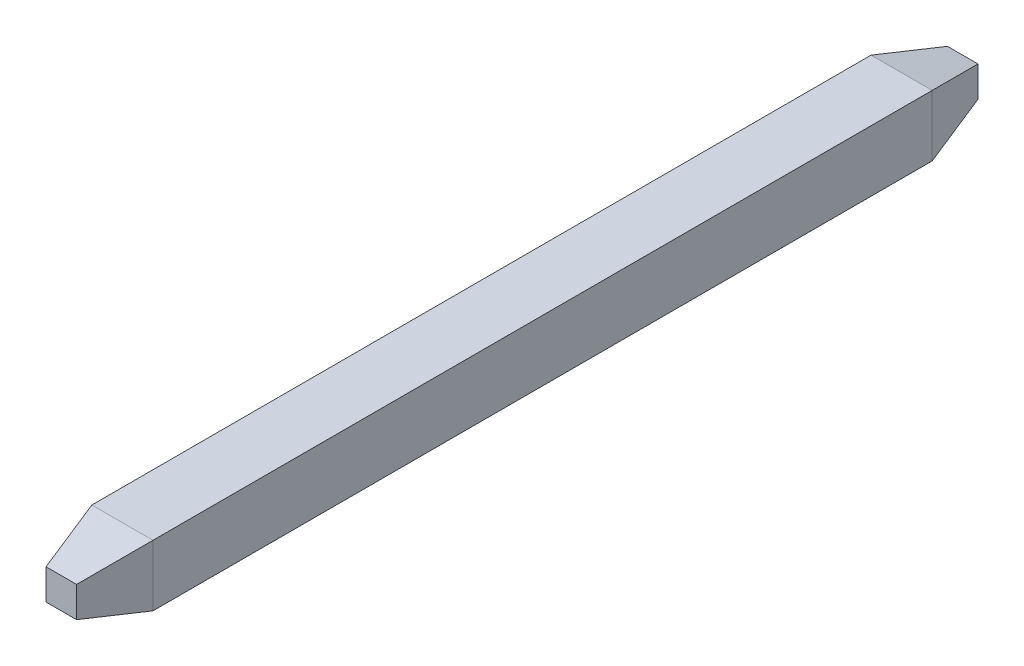
ISO-10303-21;
HEADER;
FILE_DESCRIPTION(('STEP AP214'),'2;1');
FILE_NAME('part.step','',(''),(''),'','','');
FILE_SCHEMA(('AUTOMOTIVE_DESIGN { 1 0 10303 214 1 1 1 1 }'));
ENDSEC;
DATA;
#1=APPLICATION_CONTEXT('core data for automotive mechanical design processes');
#2=APPLICATION_PROTOCOL_DEFINITION('international standard','automotive_design',2000,#1);
#3=PRODUCT_CONTEXT('',#1,'mechanical');
#4=PRODUCT('Part','Part','',(#3));
#5=PRODUCT_RELATED_PRODUCT_CATEGORY('part','',(#4));
#6=PRODUCT_DEFINITION_FORMATION('','',#4);
#7=PRODUCT_DEFINITION_CONTEXT('part definition',#1,'design');
#8=PRODUCT_DEFINITION('design','',#6,#7);
#9=PRODUCT_DEFINITION_SHAPE('','',#8);
#10=(LENGTH_UNIT() NAMED_UNIT(*) SI_UNIT(.MILLI.,.METRE.));
#11=(NAMED_UNIT(*) PLANE_ANGLE_UNIT() SI_UNIT($,.RADIAN.));
#12=(NAMED_UNIT(*) SI_UNIT($,.STERADIAN.) SOLID_ANGLE_UNIT());
#13=UNCERTAINTY_MEASURE_WITH_UNIT(LENGTH_MEASURE(1.E-05),#10,'distance_accuracy_value','');
#14=(GEOMETRIC_REPRESENTATION_CONTEXT(3) GLOBAL_UNCERTAINTY_ASSIGNED_CONTEXT((#13)) GLOBAL_UNIT_ASSIGNED_CONTEXT((#10,
#11,#12)) REPRESENTATION_CONTEXT('',''));
#15=CARTESIAN_POINT('',(0.,0.,0.));
#16=DIRECTION('',(0.,0.,1.));
#17=DIRECTION('',(1.,0.,0.));
#18=AXIS2_PLACEMENT_3D('',#15,#16,#17);
#19=CARTESIAN_POINT('',(-5.25,-0.95,-10.));
#20=DIRECTION('',(-0.970142500145391,0.,-0.242535625036098));
#21=DIRECTION('',(-0.242535625036098,0.,0.970142500145391));
#22=AXIS2_PLACEMENT_3D('',#19,#20,#21);
#23=PLANE('',#22);
#24=DIRECTION('',(0.235702260395515,-0.235702260395287,-0.942809041582121));
#25=VECTOR('',#24,1.);
#26=CARTESIAN_POINT('',(-5.5,0.0499999999997573,-8.99999999999994));
#27=LINE('',#26,#25);
#28=CARTESIAN_POINT('',(-5.49999999999988,0.0499999999999396,-8.99999999999996));
#29=VERTEX_POINT('',#28);
#30=CARTESIAN_POINT('',(-5.25,-0.2,-10.));
#31=VERTEX_POINT('',#30);
#32=EDGE_CURVE('E80',#29,#31,#27,.T.);
#33=ORIENTED_EDGE('',*,*,#32,.T.);
#34=DIRECTION('',(0.,1.,0.));
#35=VECTOR('',#34,1.);
#36=CARTESIAN_POINT('',(-5.25,-0.95,-10.));
#37=LINE('',#36,#35);
#38=CARTESIAN_POINT('',(-5.25,-0.700000000000061,-10.));
#39=VERTEX_POINT('',#38);
#40=EDGE_CURVE('E20',#39,#31,#37,.T.);
#41=ORIENTED_EDGE('',*,*,#40,.F.);
#42=DIRECTION('',(-0.235702260395515,-0.235702260395287,0.942809041582121));
#43=VECTOR('',#42,1.);
#44=CARTESIAN_POINT('',(-5.25,-0.700000000000243,-10.0000000000001));
#45=LINE('',#44,#43);
#46=CARTESIAN_POINT('',(-5.49999999999988,-0.95,-8.99999999999997));
#47=VERTEX_POINT('',#46);
#48=EDGE_CURVE('E84',#39,#47,#45,.T.);
#49=ORIENTED_EDGE('',*,*,#48,.T.);
#50=DIRECTION('',(0.,1.,0.));
#51=VECTOR('',#50,1.);
#52=CARTESIAN_POINT('',(-5.5,-0.45,-9.));
#53=LINE('',#52,#51);
#54=EDGE_CURVE('E105',#47,#29,#53,.T.);
#55=ORIENTED_EDGE('',*,*,#54,.T.);
#56=EDGE_LOOP('',(#33,#41,#49,#55));
#57=FACE_BOUND('',#56,.T.);
#58=ADVANCED_FACE('F17',(#57),#23,.T.);
#59=CARTESIAN_POINT('',(-5.25,0.05,4.75));
#60=DIRECTION('',(-0.970142500145391,0.,0.242535625036098));
#61=DIRECTION('',(0.242535625036098,0.,0.970142500145391));
#62=AXIS2_PLACEMENT_3D('',#59,#60,#61);
#63=PLANE('',#62);
#64=DIRECTION('',(0.235702260395515,0.235702260395287,0.942809041582121));
#65=VECTOR('',#64,1.);
#66=CARTESIAN_POINT('',(-5.5,-0.949999999999758,3.74999999999994));
#67=LINE('',#66,#65);
#68=CARTESIAN_POINT('',(-5.49999999999988,-0.94999999999997,3.74999999999996));
#69=VERTEX_POINT('',#68);
#70=CARTESIAN_POINT('',(-5.25,-0.7,4.75));
#71=VERTEX_POINT('',#70);
#72=EDGE_CURVE('E109',#69,#71,#67,.T.);
#73=ORIENTED_EDGE('',*,*,#72,.T.);
#74=DIRECTION('',(0.,1.,0.));
#75=VECTOR('',#74,1.);
#76=CARTESIAN_POINT('',(-5.25,0.05,4.75));
#77=LINE('',#76,#75);
#78=CARTESIAN_POINT('',(-5.25,-0.199999999999939,4.75000000000001));
#79=VERTEX_POINT('',#78);
#80=EDGE_CURVE('E111',#79,#71,#77,.F.);
#81=ORIENTED_EDGE('',*,*,#80,.F.);
#82=DIRECTION('',(-0.235702260395515,0.235702260395287,-0.942809041582121));
#83=VECTOR('',#82,1.);
#84=CARTESIAN_POINT('',(-5.25,-0.199999999999758,4.75000000000006));
#85=LINE('',#84,#83);
#86=CARTESIAN_POINT('',(-5.49999999999988,0.0499999999999999,3.74999999999997));
#87=VERTEX_POINT('',#86);
#88=EDGE_CURVE('E117',#79,#87,#85,.T.);
#89=ORIENTED_EDGE('',*,*,#88,.T.);
#90=DIRECTION('',(0.,1.,0.));
#91=VECTOR('',#90,1.);
#92=CARTESIAN_POINT('',(-5.5,-0.45,3.75));
#93=LINE('',#92,#91);
#94=EDGE_CURVE('E107',#87,#69,#93,.F.);
#95=ORIENTED_EDGE('',*,*,#94,.T.);
#96=EDGE_LOOP('',(#73,#81,#89,#95));
#97=FACE_BOUND('',#96,.T.);
#98=ADVANCED_FACE('F175',(#97),#63,.T.);
#99=CARTESIAN_POINT('',(-5.5,-0.95,-10.));
#100=DIRECTION('',(0.,0.,-1.));
#101=DIRECTION('',(-1.,0.,0.));
#102=AXIS2_PLACEMENT_3D('',#99,#100,#101);
#103=PLANE('',#102);
#104=DIRECTION('',(0.,1.,0.));
#105=VECTOR('',#104,1.);
#106=CARTESIAN_POINT('',(-4.74999999999976,-0.45,-10.0000000000001));
#107=LINE('',#106,#105);
#108=CARTESIAN_POINT('',(-4.74999999999994,-0.2,-10.));
#109=VERTEX_POINT('',#108);
#110=CARTESIAN_POINT('',(-4.74999999999994,-0.700000000000061,-10.));
#111=VERTEX_POINT('',#110);
#112=EDGE_CURVE('E92',#109,#111,#107,.F.);
#113=ORIENTED_EDGE('',*,*,#112,.T.);
#114=DIRECTION('',(1.,0.,0.));
#115=VECTOR('',#114,1.);
#116=CARTESIAN_POINT('',(-5.5,-0.700000000000243,-10.0000000000001));
#117=LINE('',#116,#115);
#118=EDGE_CURVE('E89',#111,#39,#117,.F.);
#119=ORIENTED_EDGE('',*,*,#118,.T.);
#120=ORIENTED_EDGE('',*,*,#40,.T.);
#121=DIRECTION('',(1.,0.,0.));
#122=VECTOR('',#121,1.);
#123=CARTESIAN_POINT('',(-5.5,-0.2,-10.));
#124=LINE('',#123,#122);
#125=EDGE_CURVE('E103',#31,#109,#124,.T.);
#126=ORIENTED_EDGE('',*,*,#125,.T.);
#127=EDGE_LOOP('',(#113,#119,#120,#126));
#128=FACE_BOUND('',#127,.T.);
#129=ADVANCED_FACE('F90',(#128),#103,.T.);
#130=CARTESIAN_POINT('',(-5.5,-0.95,-9.));
#131=DIRECTION('',(0.,0.970142500145391,0.242535625036098));
#132=DIRECTION('',(0.,-0.242535625036098,0.970142500145391));
#133=AXIS2_PLACEMENT_3D('',#130,#131,#132);
#134=PLANE('',#133);
#135=DIRECTION('',(0.235702260395287,-0.235702260395516,0.94280904158212));
#136=VECTOR('',#135,1.);
#137=CARTESIAN_POINT('',(-4.74999999999976,-0.7,-10.0000000000001));
#138=LINE('',#137,#136);
#139=CARTESIAN_POINT('',(-4.5,-0.949999999999999,-9.));
#140=VERTEX_POINT('',#139);
#141=EDGE_CURVE('E132',#111,#140,#138,.T.);
#142=ORIENTED_EDGE('',*,*,#141,.T.);
#143=DIRECTION('',(1.,0.,0.));
#144=VECTOR('',#143,1.);
#145=CARTESIAN_POINT('',(-5.5,-0.949999999999997,-9.));
#146=LINE('',#145,#144);
#147=EDGE_CURVE('E99',#47,#140,#146,.T.);
#148=ORIENTED_EDGE('',*,*,#147,.F.);
#149=ORIENTED_EDGE('',*,*,#48,.F.);
#150=ORIENTED_EDGE('',*,*,#118,.F.);
#151=EDGE_LOOP('',(#142,#148,#149,#150));
#152=FACE_BOUND('',#151,.T.);
#153=ADVANCED_FACE('F97',(#152),#134,.F.);
#154=CARTESIAN_POINT('',(-5.5,-0.2,-10.));
#155=DIRECTION('',(0.,-0.970142500145391,0.242535625036098));
#156=DIRECTION('',(0.,-0.242535625036098,-0.970142500145391));
#157=AXIS2_PLACEMENT_3D('',#154,#155,#156);
#158=PLANE('',#157);
#159=ORIENTED_EDGE('',*,*,#32,.F.);
#160=DIRECTION('',(1.,0.,0.));
#161=VECTOR('',#160,1.);
#162=CARTESIAN_POINT('',(-5.5,0.05,-9.));
#163=LINE('',#162,#161);
#164=CARTESIAN_POINT('',(-4.5,0.0499999999998787,-8.99999999999997));
#165=VERTEX_POINT('',#164);
#166=EDGE_CURVE('E134',#165,#29,#163,.F.);
#167=ORIENTED_EDGE('',*,*,#166,.F.);
#168=DIRECTION('',(-0.235702260395287,-0.235702260395516,-0.94280904158212));
#169=VECTOR('',#168,1.);
#170=CARTESIAN_POINT('',(-4.5,0.0500000000000002,-9.));
#171=LINE('',#170,#169);
#172=EDGE_CURVE('E128',#165,#109,#171,.T.);
#173=ORIENTED_EDGE('',*,*,#172,.T.);
#174=ORIENTED_EDGE('',*,*,#125,.F.);
#175=EDGE_LOOP('',(#159,#167,#173,#174));
#176=FACE_BOUND('',#175,.T.);
#177=ADVANCED_FACE('F184',(#176),#158,.F.);
#178=CARTESIAN_POINT('',(-5.5,-0.45,-2.625));
#179=DIRECTION('',(1.,0.,0.));
#180=DIRECTION('',(0.,0.,-1.));
#181=AXIS2_PLACEMENT_3D('',#178,#179,#180);
#182=PLANE('',#181);
#183=DIRECTION('',(0.,0.,1.));
#184=VECTOR('',#183,1.);
#185=CARTESIAN_POINT('',(-5.5,0.05,-10.));
#186=LINE('',#185,#184);
#187=EDGE_CURVE('E137',#29,#87,#186,.T.);
#188=ORIENTED_EDGE('',*,*,#187,.F.);
#189=ORIENTED_EDGE('',*,*,#54,.F.);
#190=DIRECTION('',(0.,0.,-1.));
#191=VECTOR('',#190,1.);
#192=CARTESIAN_POINT('',(-5.5,-0.95,4.75));
#193=LINE('',#192,#191);
#194=EDGE_CURVE('E122',#69,#47,#193,.T.);
#195=ORIENTED_EDGE('',*,*,#194,.F.);
#196=ORIENTED_EDGE('',*,*,#94,.F.);
#197=EDGE_LOOP('',(#188,#189,#195,#196));
#198=FACE_BOUND('',#197,.T.);
#199=ADVANCED_FACE('F186',(#198),#182,.F.);
#200=CARTESIAN_POINT('',(-5.5,-0.7,4.75));
#201=DIRECTION('',(0.,0.970142500145391,-0.242535625036098));
#202=DIRECTION('',(0.,0.242535625036098,0.970142500145391));
#203=AXIS2_PLACEMENT_3D('',#200,#201,#202);
#204=PLANE('',#203);
#205=ORIENTED_EDGE('',*,*,#72,.F.);
#206=DIRECTION('',(1.,0.,0.));
#207=VECTOR('',#206,1.);
#208=CARTESIAN_POINT('',(-5.5,-0.95,3.75));
#209=LINE('',#208,#207);
#210=CARTESIAN_POINT('',(-4.5,-0.949999999999879,3.74999999999997));
#211=VERTEX_POINT('',#210);
#212=EDGE_CURVE('E125',#211,#69,#209,.F.);
#213=ORIENTED_EDGE('',*,*,#212,.F.);
#214=DIRECTION('',(-0.235702260395287,0.235702260395516,0.942809041582121));
#215=VECTOR('',#214,1.);
#216=CARTESIAN_POINT('',(-4.5,-0.95,3.75));
#217=LINE('',#216,#215);
#218=CARTESIAN_POINT('',(-4.74999999999994,-0.7,4.75000000000001));
#219=VERTEX_POINT('',#218);
#220=EDGE_CURVE('E142',#211,#219,#217,.T.);
#221=ORIENTED_EDGE('',*,*,#220,.T.);
#222=DIRECTION('',(1.,0.,0.));
#223=VECTOR('',#222,1.);
#224=CARTESIAN_POINT('',(-5.5,-0.7,4.75));
#225=LINE('',#224,#223);
#226=EDGE_CURVE('E114',#71,#219,#225,.T.);
#227=ORIENTED_EDGE('',*,*,#226,.F.);
#228=EDGE_LOOP('',(#205,#213,#221,#227));
#229=FACE_BOUND('',#228,.T.);
#230=ADVANCED_FACE('F170',(#229),#204,.F.);
#231=CARTESIAN_POINT('',(-5.5,0.05,4.75));
#232=DIRECTION('',(0.,0.,1.));
#233=DIRECTION('',(1.,0.,0.));
#234=AXIS2_PLACEMENT_3D('',#231,#232,#233);
#235=PLANE('',#234);
#236=DIRECTION('',(0.,1.,0.));
#237=VECTOR('',#236,1.);
#238=CARTESIAN_POINT('',(-4.74999999999976,-0.45,4.75000000000006));
#239=LINE('',#238,#237);
#240=CARTESIAN_POINT('',(-4.74999999999994,-0.199999999999939,4.75000000000003));
#241=VERTEX_POINT('',#240);
#242=EDGE_CURVE('E144',#219,#241,#239,.T.);
#243=ORIENTED_EDGE('',*,*,#242,.T.);
#244=DIRECTION('',(1.,0.,0.));
#245=VECTOR('',#244,1.);
#246=CARTESIAN_POINT('',(-5.5,-0.199999999999758,4.75000000000006));
#247=LINE('',#246,#245);
#248=EDGE_CURVE('E119',#241,#79,#247,.F.);
#249=ORIENTED_EDGE('',*,*,#248,.T.);
#250=ORIENTED_EDGE('',*,*,#80,.T.);
#251=ORIENTED_EDGE('',*,*,#226,.T.);
#252=EDGE_LOOP('',(#243,#249,#250,#251));
#253=FACE_BOUND('',#252,.T.);
#254=ADVANCED_FACE('F173',(#253),#235,.T.);
#255=CARTESIAN_POINT('',(-5.5,0.05,3.75));
#256=DIRECTION('',(0.,-0.970142500145391,-0.242535625036098));
#257=DIRECTION('',(0.,0.242535625036098,-0.970142500145391));
#258=AXIS2_PLACEMENT_3D('',#255,#256,#257);
#259=PLANE('',#258);
#260=DIRECTION('',(0.235702260395287,0.235702260395516,-0.942809041582121));
#261=VECTOR('',#260,1.);
#262=CARTESIAN_POINT('',(-4.74999999999976,-0.2,4.75000000000006));
#263=LINE('',#262,#261);
#264=CARTESIAN_POINT('',(-4.5,0.05,3.75));
#265=VERTEX_POINT('',#264);
#266=EDGE_CURVE('E35',#241,#265,#263,.T.);
#267=ORIENTED_EDGE('',*,*,#266,.T.);
#268=DIRECTION('',(1.,0.,0.));
#269=VECTOR('',#268,1.);
#270=CARTESIAN_POINT('',(-5.5,0.05,3.75));
#271=LINE('',#270,#269);
#272=EDGE_CURVE('E140',#87,#265,#271,.T.);
#273=ORIENTED_EDGE('',*,*,#272,.F.);
#274=ORIENTED_EDGE('',*,*,#88,.F.);
#275=ORIENTED_EDGE('',*,*,#248,.F.);
#276=EDGE_LOOP('',(#267,#273,#274,#275));
#277=FACE_BOUND('',#276,.T.);
#278=ADVANCED_FACE('F209',(#277),#259,.F.);
#279=CARTESIAN_POINT('',(-5.5,-0.95,4.75));
#280=DIRECTION('',(0.,-1.,0.));
#281=DIRECTION('',(0.,0.,-1.));
#282=AXIS2_PLACEMENT_3D('',#279,#280,#281);
#283=PLANE('',#282);
#284=DIRECTION('',(0.,0.,-1.));
#285=VECTOR('',#284,1.);
#286=CARTESIAN_POINT('',(-4.5,-0.95,-2.625));
#287=LINE('',#286,#285);
#288=EDGE_CURVE('E147',#211,#140,#287,.T.);
#289=ORIENTED_EDGE('',*,*,#288,.F.);
#290=ORIENTED_EDGE('',*,*,#212,.T.);
#291=ORIENTED_EDGE('',*,*,#194,.T.);
#292=ORIENTED_EDGE('',*,*,#147,.T.);
#293=EDGE_LOOP('',(#289,#290,#291,#292));
#294=FACE_BOUND('',#293,.T.);
#295=ADVANCED_FACE('F179',(#294),#283,.T.);
#296=CARTESIAN_POINT('',(-4.5,-0.45,-9.));
#297=DIRECTION('',(-0.970142500145391,0.,0.242535625036098));
#298=DIRECTION('',(0.242535625036098,0.,0.970142500145391));
#299=AXIS2_PLACEMENT_3D('',#296,#297,#298);
#300=PLANE('',#299);
#301=ORIENTED_EDGE('',*,*,#141,.F.);
#302=ORIENTED_EDGE('',*,*,#112,.F.);
#303=ORIENTED_EDGE('',*,*,#172,.F.);
#304=DIRECTION('',(0.,1.,0.));
#305=VECTOR('',#304,1.);
#306=CARTESIAN_POINT('',(-4.5,-0.45,-9.));
#307=LINE('',#306,#305);
#308=EDGE_CURVE('E150',#140,#165,#307,.T.);
#309=ORIENTED_EDGE('',*,*,#308,.F.);
#310=EDGE_LOOP('',(#301,#302,#303,#309));
#311=FACE_BOUND('',#310,.T.);
#312=ADVANCED_FACE('F182',(#311),#300,.F.);
#313=CARTESIAN_POINT('',(-5.5,0.05,-10.));
#314=DIRECTION('',(0.,1.,0.));
#315=DIRECTION('',(0.,0.,1.));
#316=AXIS2_PLACEMENT_3D('',#313,#314,#315);
#317=PLANE('',#316);
#318=ORIENTED_EDGE('',*,*,#187,.T.);
#319=ORIENTED_EDGE('',*,*,#272,.T.);
#320=DIRECTION('',(0.,0.,-1.));
#321=VECTOR('',#320,1.);
#322=CARTESIAN_POINT('',(-4.5,0.05,-2.625));
#323=LINE('',#322,#321);
#324=EDGE_CURVE('E26',#165,#265,#323,.F.);
#325=ORIENTED_EDGE('',*,*,#324,.F.);
#326=ORIENTED_EDGE('',*,*,#166,.T.);
#327=EDGE_LOOP('',(#318,#319,#325,#326));
#328=FACE_BOUND('',#327,.T.);
#329=ADVANCED_FACE('F160',(#328),#317,.T.);
#330=CARTESIAN_POINT('',(-4.5,-0.45,3.75));
#331=DIRECTION('',(-0.970142500145391,0.,-0.242535625036098));
#332=DIRECTION('',(-0.242535625036098,0.,0.970142500145391));
#333=AXIS2_PLACEMENT_3D('',#330,#331,#332);
#334=PLANE('',#333);
#335=ORIENTED_EDGE('',*,*,#266,.F.);
#336=ORIENTED_EDGE('',*,*,#242,.F.);
#337=ORIENTED_EDGE('',*,*,#220,.F.);
#338=DIRECTION('',(0.,1.,0.));
#339=VECTOR('',#338,1.);
#340=CARTESIAN_POINT('',(-4.5,-0.45,3.75));
#341=LINE('',#340,#339);
#342=EDGE_CURVE('E11',#265,#211,#341,.F.);
#343=ORIENTED_EDGE('',*,*,#342,.F.);
#344=EDGE_LOOP('',(#335,#336,#337,#343));
#345=FACE_BOUND('',#344,.T.);
#346=ADVANCED_FACE('F165',(#345),#334,.F.);
#347=CARTESIAN_POINT('',(-4.5,-0.45,-2.625));
#348=DIRECTION('',(1.,0.,0.));
#349=DIRECTION('',(0.,0.,-1.));
#350=AXIS2_PLACEMENT_3D('',#347,#348,#349);
#351=PLANE('',#350);
#352=ORIENTED_EDGE('',*,*,#324,.T.);
#353=ORIENTED_EDGE('',*,*,#342,.T.);
#354=ORIENTED_EDGE('',*,*,#288,.T.);
#355=ORIENTED_EDGE('',*,*,#308,.T.);
#356=EDGE_LOOP('',(#352,#353,#354,#355));
#357=FACE_BOUND('',#356,.T.);
#358=ADVANCED_FACE('F156',(#357),#351,.T.);
#359=CLOSED_SHELL('',(#58,#98,#129,#153,#177,#199,#230,#254,#278,#295,#312,#329,#346,#358));
#360=MANIFOLD_SOLID_BREP('B1',#359);
#361=ADVANCED_BREP_SHAPE_REPRESENTATION('',(#18,#360),#14);
#362=SHAPE_DEFINITION_REPRESENTATION(#9,#361);
ENDSEC;
END-ISO-10303-21;
